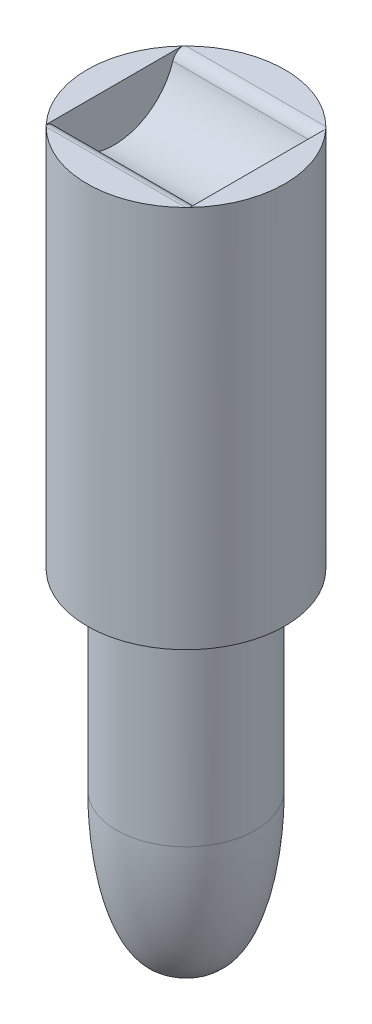
ISO-10303-21;
HEADER;
FILE_DESCRIPTION(('STEP AP214'),'2;1');
FILE_NAME('part.step','',(''),(''),'','','');
FILE_SCHEMA(('AUTOMOTIVE_DESIGN { 1 0 10303 214 1 1 1 1 }'));
ENDSEC;
DATA;
#1=APPLICATION_CONTEXT('core data for automotive mechanical design processes');
#2=APPLICATION_PROTOCOL_DEFINITION('international standard','automotive_design',2000,#1);
#3=PRODUCT_CONTEXT('',#1,'mechanical');
#4=PRODUCT('Part','Part','',(#3));
#5=PRODUCT_RELATED_PRODUCT_CATEGORY('part','',(#4));
#6=PRODUCT_DEFINITION_FORMATION('','',#4);
#7=PRODUCT_DEFINITION_CONTEXT('part definition',#1,'design');
#8=PRODUCT_DEFINITION('design','',#6,#7);
#9=PRODUCT_DEFINITION_SHAPE('','',#8);
#10=(LENGTH_UNIT() NAMED_UNIT(*) SI_UNIT(.MILLI.,.METRE.));
#11=(NAMED_UNIT(*) PLANE_ANGLE_UNIT() SI_UNIT($,.RADIAN.));
#12=(NAMED_UNIT(*) SI_UNIT($,.STERADIAN.) SOLID_ANGLE_UNIT());
#13=UNCERTAINTY_MEASURE_WITH_UNIT(LENGTH_MEASURE(1.E-05),#10,'distance_accuracy_value','');
#14=(GEOMETRIC_REPRESENTATION_CONTEXT(3) GLOBAL_UNCERTAINTY_ASSIGNED_CONTEXT((#13)) GLOBAL_UNIT_ASSIGNED_CONTEXT((#10,
#11,#12)) REPRESENTATION_CONTEXT('',''));
#15=CARTESIAN_POINT('',(0.,0.,0.));
#16=DIRECTION('',(0.,0.,1.));
#17=DIRECTION('',(1.,0.,0.));
#18=AXIS2_PLACEMENT_3D('',#15,#16,#17);
#19=CARTESIAN_POINT('',(0.,15.,0.));
#20=DIRECTION('',(0.,1.,0.));
#21=DIRECTION('',(0.,0.,1.));
#22=AXIS2_PLACEMENT_3D('',#19,#20,#21);
#23=PLANE('',#22);
#24=CARTESIAN_POINT('',(0.,15.,0.));
#25=DIRECTION('',(0.,1.,0.));
#26=DIRECTION('',(0.,0.,1.));
#27=AXIS2_PLACEMENT_3D('',#24,#25,#26);
#28=CIRCLE('',#27,2.06499999999998);
#29=CARTESIAN_POINT('',(1.45727267657518,15.,-1.4630725703489));
#30=VERTEX_POINT('',#29);
#31=CARTESIAN_POINT('',(-1.45727267657518,15.,-1.4630725703489));
#32=VERTEX_POINT('',#31);
#33=EDGE_CURVE('E151',#30,#32,#28,.T.);
#34=ORIENTED_EDGE('',*,*,#33,.T.);
#35=DIRECTION('',(-1.,0.,0.));
#36=VECTOR('',#35,1.);
#37=CARTESIAN_POINT('',(0.,15.,-1.4630725703489));
#38=LINE('',#37,#36);
#39=EDGE_CURVE('E129',#32,#30,#38,.F.);
#40=ORIENTED_EDGE('',*,*,#39,.T.);
#41=EDGE_LOOP('',(#34,#40));
#42=FACE_BOUND('',#41,.T.);
#43=ADVANCED_FACE('F48',(#42),#23,.T.);
#44=CARTESIAN_POINT('',(1.5,15.,1.41923394829743));
#45=VERTEX_POINT('',#44);
#46=CARTESIAN_POINT('',(1.5,15.,-1.41923394829743));
#47=VERTEX_POINT('',#46);
#48=EDGE_CURVE('E148',#45,#47,#28,.T.);
#49=ORIENTED_EDGE('',*,*,#48,.T.);
#50=DIRECTION('',(0.,0.,-1.));
#51=VECTOR('',#50,1.);
#52=CARTESIAN_POINT('',(1.5,15.,0.));
#53=LINE('',#52,#51);
#54=EDGE_CURVE('E66',#45,#47,#53,.T.);
#55=ORIENTED_EDGE('',*,*,#54,.F.);
#56=EDGE_LOOP('',(#49,#55));
#57=FACE_BOUND('',#56,.T.);
#58=ADVANCED_FACE('F236',(#57),#23,.T.);
#59=CARTESIAN_POINT('',(-1.45727267657518,15.,1.4630725703489));
#60=VERTEX_POINT('',#59);
#61=CARTESIAN_POINT('',(1.45727267657518,15.,1.4630725703489));
#62=VERTEX_POINT('',#61);
#63=EDGE_CURVE('E137',#60,#62,#28,.T.);
#64=ORIENTED_EDGE('',*,*,#63,.T.);
#65=DIRECTION('',(-1.,0.,0.));
#66=VECTOR('',#65,1.);
#67=CARTESIAN_POINT('',(0.,15.,1.4630725703489));
#68=LINE('',#67,#66);
#69=EDGE_CURVE('E118',#62,#60,#68,.T.);
#70=ORIENTED_EDGE('',*,*,#69,.T.);
#71=EDGE_LOOP('',(#64,#70));
#72=FACE_BOUND('',#71,.T.);
#73=ADVANCED_FACE('F143',(#72),#23,.T.);
#74=CARTESIAN_POINT('',(0.,7.,0.));
#75=DIRECTION('',(0.,-1.,0.));
#76=DIRECTION('',(0.,0.,-1.));
#77=AXIS2_PLACEMENT_3D('',#74,#75,#76);
#78=CYLINDRICAL_SURFACE('',#77,1.45);
#79=CARTESIAN_POINT('',(0.,3.,1.45));
#80=CARTESIAN_POINT('',(-0.189804399936706,3.,1.45));
#81=CARTESIAN_POINT('',(-0.379534576647298,3.,1.41226032138713));
#82=CARTESIAN_POINT('',(-0.730247377211466,3.,1.2669903228956));
#83=CARTESIAN_POINT('',(-0.891092854426223,3.,1.15951681101477));
#84=CARTESIAN_POINT('',(-1.15951681101477,3.,0.891092854426216));
#85=CARTESIAN_POINT('',(-1.2669903228956,3.,0.730247377211465));
#86=CARTESIAN_POINT('',(-1.41226032138713,3.,0.379534576647291));
#87=CARTESIAN_POINT('',(-1.45,3.,0.189804399936683));
#88=CARTESIAN_POINT('',(-1.45,3.,-0.189804399936678));
#89=CARTESIAN_POINT('',(-1.41226032138713,3.,-0.379534576647295));
#90=CARTESIAN_POINT('',(-1.2669903228956,3.,-0.730247377211469));
#91=CARTESIAN_POINT('',(-1.15951681101476,3.,-0.891092854426227));
#92=CARTESIAN_POINT('',(-0.891092854426228,3.,-1.15951681101476));
#93=CARTESIAN_POINT('',(-0.730247377211463,3.,-1.2669903228956));
#94=CARTESIAN_POINT('',(-0.379534576647293,3.,-1.41226032138713));
#95=CARTESIAN_POINT('',(-0.18980439993668,3.,-1.45));
#96=CARTESIAN_POINT('',(0.18980439993668,3.,-1.45));
#97=CARTESIAN_POINT('',(0.379534576647295,3.,-1.41226032138713));
#98=CARTESIAN_POINT('',(0.730247377211469,3.,-1.2669903228956));
#99=CARTESIAN_POINT('',(0.891092854426224,3.,-1.15951681101476));
#100=CARTESIAN_POINT('',(1.15951681101476,3.,-0.891092854426225));
#101=CARTESIAN_POINT('',(1.2669903228956,3.,-0.73024737721147));
#102=CARTESIAN_POINT('',(1.41226032138713,3.,-0.379534576647291));
#103=CARTESIAN_POINT('',(1.45,3.,-0.18980439993668));
#104=CARTESIAN_POINT('',(1.45,3.,0.18980439993668));
#105=CARTESIAN_POINT('',(1.41226032138713,3.,0.379534576647295));
#106=CARTESIAN_POINT('',(1.2669903228956,3.,0.730247377211464));
#107=CARTESIAN_POINT('',(1.15951681101476,3.,0.891092854426228));
#108=CARTESIAN_POINT('',(0.891092854426228,3.,1.15951681101476));
#109=CARTESIAN_POINT('',(0.730247377211467,3.,1.2669903228956));
#110=CARTESIAN_POINT('',(0.379534576647294,3.,1.41226032138713));
#111=CARTESIAN_POINT('',(0.189804399936705,3.,1.45));
#112=CARTESIAN_POINT('',(0.,3.,1.45));
#113=(BOUNDED_CURVE() B_SPLINE_CURVE(3,(#79,#80,#81,#82,#83,#84,#85,#86,#87,#88,#89,#90,#91,#92,
#93,#94,#95,#96,#97,#98,#99,#100,#101,#102,#103,#104,#105,#106,#107,#108,#109,#110,#111,#112),
.UNSPECIFIED.,.T.,.F.) B_SPLINE_CURVE_WITH_KNOTS((4,2,2,2,2,2,2,2,2,2,2,2,2,2,2,2,4),(0.,
0.392699081698725,0.785398163397448,1.17809724509617,1.5707963267949,1.96349540849362,
2.35619449019234,2.74889357189107,3.14159265358979,3.53429173528852,3.92699081698724,
4.31968989868597,4.71238898038469,5.10508806208341,5.49778714378214,5.89048622548086,
6.28318530717959),
.UNSPECIFIED.) CURVE() GEOMETRIC_REPRESENTATION_ITEM() RATIONAL_B_SPLINE_CURVE((1.,1.,1.,1.,1.,
1.,1.,1.,1.,1.,1.,1.,1.,1.,1.,1.,1.,1.,1.,1.,1.,1.,1.,1.,1.,1.,1.,1.,1.,1.,1.,1.,1.,1.)) REPRESENTATION_ITEM(''));
#114=CARTESIAN_POINT('',(0.,3.,1.45));
#115=VERTEX_POINT('',#114);
#116=EDGE_CURVE('E161',#115,#115,#113,.F.);
#117=ORIENTED_EDGE('',*,*,#116,.T.);
#118=EDGE_LOOP('',(#117));
#119=FACE_BOUND('',#118,.T.);
#120=CARTESIAN_POINT('',(0.,7.,0.));
#121=DIRECTION('',(0.,1.,0.));
#122=DIRECTION('',(0.,0.,1.));
#123=AXIS2_PLACEMENT_3D('',#120,#121,#122);
#124=CIRCLE('',#123,1.45);
#125=CARTESIAN_POINT('',(0.,7.,1.45));
#126=VERTEX_POINT('',#125);
#127=EDGE_CURVE('E157',#126,#126,#124,.T.);
#128=ORIENTED_EDGE('',*,*,#127,.F.);
#129=EDGE_LOOP('',(#128));
#130=FACE_BOUND('',#129,.T.);
#131=ADVANCED_FACE('F238',(#119,#130),#78,.T.);
#132=CARTESIAN_POINT('',(0.,0.,0.));
#133=DIRECTION('',(0.,1.,0.));
#134=DIRECTION('',(0.,0.,1.));
#135=AXIS2_PLACEMENT_3D('',#132,#133,#134);
#136=PLANE('',#135);
#137=CARTESIAN_POINT('',(0.,0.,0.45));
#138=CARTESIAN_POINT('',(0.0589048137734603,0.,0.45));
#139=CARTESIAN_POINT('',(0.117786592752609,0.,0.438287685947729));
#140=CARTESIAN_POINT('',(0.226628496375971,0.,0.393203893312428));
#141=CARTESIAN_POINT('',(0.276546058270209,0.,0.359850044797685));
#142=CARTESIAN_POINT('',(0.359850044797684,0.,0.276546058270207));
#143=CARTESIAN_POINT('',(0.393203893312429,0.,0.226628496375972));
#144=CARTESIAN_POINT('',(0.438287685947729,0.,0.117786592752609));
#145=CARTESIAN_POINT('',(0.45,0.,0.0589048137734525));
#146=CARTESIAN_POINT('',(0.45,0.,-0.0589048137734524));
#147=CARTESIAN_POINT('',(0.43828768594773,0.,-0.117786592752608));
#148=CARTESIAN_POINT('',(0.393203893312427,0.,-0.226628496375973));
#149=CARTESIAN_POINT('',(0.359850044797684,0.,-0.276546058270207));
#150=CARTESIAN_POINT('',(0.276546058270208,0.,-0.359850044797686));
#151=CARTESIAN_POINT('',(0.226628496375972,0.,-0.393203893312427));
#152=CARTESIAN_POINT('',(0.11778659275261,0.,-0.43828768594773));
#153=CARTESIAN_POINT('',(0.0589048137734525,0.,-0.45));
#154=CARTESIAN_POINT('',(-0.0589048137734524,0.,-0.45));
#155=CARTESIAN_POINT('',(-0.117786592752608,0.,-0.438287685947731));
#156=CARTESIAN_POINT('',(-0.226628496375971,0.,-0.393203893312428));
#157=CARTESIAN_POINT('',(-0.276546058270207,0.,-0.359850044797684));
#158=CARTESIAN_POINT('',(-0.359850044797686,0.,-0.276546058270208));
#159=CARTESIAN_POINT('',(-0.393203893312427,0.,-0.226628496375973));
#160=CARTESIAN_POINT('',(-0.438287685947731,0.,-0.117786592752609));
#161=CARTESIAN_POINT('',(-0.45,0.,-0.0589048137734518));
#162=CARTESIAN_POINT('',(-0.45,0.,0.0589048137734533));
#163=CARTESIAN_POINT('',(-0.438287685947731,0.,0.117786592752607));
#164=CARTESIAN_POINT('',(-0.393203893312427,0.,0.226628496375972));
#165=CARTESIAN_POINT('',(-0.359850044797686,0.,0.276546058270205));
#166=CARTESIAN_POINT('',(-0.276546058270208,0.,0.359850044797686));
#167=CARTESIAN_POINT('',(-0.226628496375973,0.,0.393203893312427));
#168=CARTESIAN_POINT('',(-0.117786592752609,0.,0.438287685947731));
#169=CARTESIAN_POINT('',(-0.0589048137734604,0.,0.45));
#170=CARTESIAN_POINT('',(0.,0.,0.45));
#171=(BOUNDED_CURVE() B_SPLINE_CURVE(3,(#137,#138,#139,#140,#141,#142,#143,#144,#145,#146,#147,
#148,#149,#150,#151,#152,#153,#154,#155,#156,#157,#158,#159,#160,#161,#162,#163,#164,#165,#166,
#167,#168,#169,#170),.UNSPECIFIED.,.T.,.F.) B_SPLINE_CURVE_WITH_KNOTS((4,2,2,2,2,2,2,2,2,2,2,2,
2,2,2,2,4),(0.,0.392699081698724,0.785398163397448,1.17809724509617,1.5707963267949,
1.96349540849362,2.35619449019234,2.74889357189107,3.14159265358979,3.53429173528852,
3.92699081698724,4.31968989868597,4.71238898038469,5.10508806208341,5.49778714378214,
5.89048622548086,6.28318530717959),
.UNSPECIFIED.) CURVE() GEOMETRIC_REPRESENTATION_ITEM() RATIONAL_B_SPLINE_CURVE((1.,1.,1.,1.,1.,
1.,1.,1.,1.,1.,1.,1.,1.,1.,1.,1.,1.,1.,1.,1.,1.,1.,1.,1.,1.,1.,1.,1.,1.,1.,1.,1.,1.,1.)) REPRESENTATION_ITEM(''));
#172=CARTESIAN_POINT('',(0.,0.,0.45));
#173=VERTEX_POINT('',#172);
#174=EDGE_CURVE('E346',#173,#173,#171,.F.);
#175=ORIENTED_EDGE('',*,*,#174,.T.);
#176=EDGE_LOOP('',(#175));
#177=FACE_BOUND('',#176,.T.);
#178=ADVANCED_FACE('F196',(#177),#136,.F.);
#179=CARTESIAN_POINT('',(0.,15.,0.));
#180=DIRECTION('',(0.,-1.,0.));
#181=DIRECTION('',(0.,0.,-1.));
#182=AXIS2_PLACEMENT_3D('',#179,#180,#181);
#183=CYLINDRICAL_SURFACE('',#182,2.06499999999998);
#184=ORIENTED_EDGE('',*,*,#33,.F.);
#185=CARTESIAN_POINT('',(1.45727267657518,15.,-1.4630725703489));
#186=CARTESIAN_POINT('',(1.4647692687819,14.9999992078518,-1.45560640391891));
#187=CARTESIAN_POINT('',(1.47220954596814,14.9996654348872,-1.44808012602613));
#188=CARTESIAN_POINT('',(1.48690380126563,14.9982983987213,-1.43298707318795));
#189=CARTESIAN_POINT('',(1.49415854632168,14.9972687778604,-1.42542071165644));
#190=CARTESIAN_POINT('',(1.50848778300309,14.9944770419405,-1.4102476435934));
#191=CARTESIAN_POINT('',(1.5155622465929,14.9927148136827,-1.40264093100643));
#192=CARTESIAN_POINT('',(1.52952453849525,14.988405261903,-1.38740324118233));
#193=CARTESIAN_POINT('',(1.53641119894096,14.9858538856625,-1.37977234473721));
#194=CARTESIAN_POINT('',(1.54316406741165,14.9828905138266,-1.37217697876384));
#195=B_SPLINE_CURVE_WITH_KNOTS('',3,(#185,#186,#187,#188,#189,#190,#191,#192,#193,#194),
.UNSPECIFIED.,.F.,.F.,(4,2,2,2,4),(0.,0.0317389513474401,0.0633130422873217,0.0948920137136338,
0.126635931963719),.UNSPECIFIED.);
#196=CARTESIAN_POINT('',(1.50000000000002,14.996126339949,-1.41923394829744));
#197=VERTEX_POINT('',#196);
#198=EDGE_CURVE('E130',#30,#197,#195,.T.);
#199=ORIENTED_EDGE('',*,*,#198,.T.);
#200=DIRECTION('',(0.,-1.,0.));
#201=VECTOR('',#200,1.);
#202=CARTESIAN_POINT('',(1.50000000000002,14.996126339949,-1.41923394829744));
#203=LINE('',#202,#201);
#204=EDGE_CURVE('E179',#197,#47,#203,.F.);
#205=ORIENTED_EDGE('',*,*,#204,.T.);
#206=ORIENTED_EDGE('',*,*,#48,.F.);
#207=DIRECTION('',(0.,-1.,0.));
#208=VECTOR('',#207,1.);
#209=CARTESIAN_POINT('',(1.5,15.,1.41923394829743));
#210=LINE('',#209,#208);
#211=CARTESIAN_POINT('',(1.50000000000002,14.996126339949,1.41923394829744));
#212=VERTEX_POINT('',#211);
#213=EDGE_CURVE('E139',#45,#212,#210,.T.);
#214=ORIENTED_EDGE('',*,*,#213,.T.);
#215=CARTESIAN_POINT('',(1.45727267657518,15.,1.4630725703489));
#216=CARTESIAN_POINT('',(1.4647692687819,14.9999992078518,1.45560640391891));
#217=CARTESIAN_POINT('',(1.47220954596814,14.9996654348872,1.44808012602613));
#218=CARTESIAN_POINT('',(1.48690380126563,14.9982983987213,1.43298707318795));
#219=CARTESIAN_POINT('',(1.49415854632168,14.9972687778604,1.42542071165644));
#220=CARTESIAN_POINT('',(1.50848778300309,14.9944770419405,1.4102476435934));
#221=CARTESIAN_POINT('',(1.5155622465929,14.9927148136827,1.40264093100643));
#222=CARTESIAN_POINT('',(1.52952453849525,14.988405261903,1.38740324118233));
#223=CARTESIAN_POINT('',(1.53641119894096,14.9858538856625,1.37977234473721));
#224=CARTESIAN_POINT('',(1.54316406741165,14.9828905138266,1.37217697876384));
#225=B_SPLINE_CURVE_WITH_KNOTS('',3,(#215,#216,#217,#218,#219,#220,#221,#222,#223,#224),
.UNSPECIFIED.,.F.,.F.,(4,2,2,2,4),(0.,0.0317389513474401,0.0633130422873217,0.0948920137136338,
0.126635931963719),.UNSPECIFIED.);
#226=EDGE_CURVE('E121',#212,#62,#225,.F.);
#227=ORIENTED_EDGE('',*,*,#226,.T.);
#228=ORIENTED_EDGE('',*,*,#63,.F.);
#229=CARTESIAN_POINT('',(-1.45727267657518,15.,1.4630725703489));
#230=CARTESIAN_POINT('',(-1.4647692687819,14.9999992078518,1.45560640391891));
#231=CARTESIAN_POINT('',(-1.47220954596814,14.9996654348872,1.44808012602613));
#232=CARTESIAN_POINT('',(-1.48690380126563,14.9982983987213,1.43298707318795));
#233=CARTESIAN_POINT('',(-1.49415854632168,14.9972687778604,1.42542071165644));
#234=CARTESIAN_POINT('',(-1.50848778300309,14.9944770419405,1.4102476435934));
#235=CARTESIAN_POINT('',(-1.5155622465929,14.9927148136827,1.40264093100643));
#236=CARTESIAN_POINT('',(-1.52952453849525,14.988405261903,1.38740324118233));
#237=CARTESIAN_POINT('',(-1.53641119894096,14.9858538856625,1.37977234473721));
#238=CARTESIAN_POINT('',(-1.54316406741165,14.9828905138266,1.37217697876384));
#239=B_SPLINE_CURVE_WITH_KNOTS('',3,(#229,#230,#231,#232,#233,#234,#235,#236,#237,#238),
.UNSPECIFIED.,.F.,.F.,(4,2,2,2,4),(0.,0.0317389513474401,0.0633130422873217,0.0948920137136338,
0.126635931963719),.UNSPECIFIED.);
#240=CARTESIAN_POINT('',(-1.50000000000002,14.996126339949,1.41923394829744));
#241=VERTEX_POINT('',#240);
#242=EDGE_CURVE('E124',#60,#241,#239,.T.);
#243=ORIENTED_EDGE('',*,*,#242,.T.);
#244=DIRECTION('',(0.,-1.,0.));
#245=VECTOR('',#244,1.);
#246=CARTESIAN_POINT('',(-1.50000000000002,14.996126339949,1.41923394829744));
#247=LINE('',#246,#245);
#248=CARTESIAN_POINT('',(-1.5,15.,1.41923394829743));
#249=VERTEX_POINT('',#248);
#250=EDGE_CURVE('E141',#241,#249,#247,.F.);
#251=ORIENTED_EDGE('',*,*,#250,.T.);
#252=CARTESIAN_POINT('',(-1.5,15.,-1.41923394829743));
#253=VERTEX_POINT('',#252);
#254=EDGE_CURVE('E145',#253,#249,#28,.T.);
#255=ORIENTED_EDGE('',*,*,#254,.F.);
#256=DIRECTION('',(0.,-1.,0.));
#257=VECTOR('',#256,1.);
#258=CARTESIAN_POINT('',(-1.5,15.,-1.41923394829743));
#259=LINE('',#258,#257);
#260=CARTESIAN_POINT('',(-1.50000000000002,14.996126339949,-1.41923394829744));
#261=VERTEX_POINT('',#260);
#262=EDGE_CURVE('E221',#253,#261,#259,.T.);
#263=ORIENTED_EDGE('',*,*,#262,.T.);
#264=CARTESIAN_POINT('',(-1.45727267657518,15.,-1.4630725703489));
#265=CARTESIAN_POINT('',(-1.4647692687819,14.9999992078518,-1.45560640391891));
#266=CARTESIAN_POINT('',(-1.47220954596814,14.9996654348872,-1.44808012602613));
#267=CARTESIAN_POINT('',(-1.48690380126563,14.9982983987213,-1.43298707318795));
#268=CARTESIAN_POINT('',(-1.49415854632168,14.9972687778604,-1.42542071165644));
#269=CARTESIAN_POINT('',(-1.50848778300309,14.9944770419405,-1.4102476435934));
#270=CARTESIAN_POINT('',(-1.5155622465929,14.9927148136827,-1.40264093100643));
#271=CARTESIAN_POINT('',(-1.52952453849525,14.988405261903,-1.38740324118233));
#272=CARTESIAN_POINT('',(-1.53641119894096,14.9858538856625,-1.37977234473721));
#273=CARTESIAN_POINT('',(-1.54316406741165,14.9828905138266,-1.37217697876384));
#274=B_SPLINE_CURVE_WITH_KNOTS('',3,(#264,#265,#266,#267,#268,#269,#270,#271,#272,#273),
.UNSPECIFIED.,.F.,.F.,(4,2,2,2,4),(0.,0.0317389513474401,0.0633130422873217,0.0948920137136338,
0.126635931963719),.UNSPECIFIED.);
#275=EDGE_CURVE('E172',#261,#32,#274,.F.);
#276=ORIENTED_EDGE('',*,*,#275,.T.);
#277=EDGE_LOOP('',(#184,#199,#205,#206,#214,#227,#228,#243,#251,#255,#263,#276));
#278=FACE_BOUND('',#277,.T.);
#279=CARTESIAN_POINT('',(0.,7.,0.));
#280=DIRECTION('',(0.,1.,0.));
#281=DIRECTION('',(0.,0.,1.));
#282=AXIS2_PLACEMENT_3D('',#279,#280,#281);
#283=CIRCLE('',#282,2.06499999999998);
#284=CARTESIAN_POINT('',(0.,7.,2.06499999999998));
#285=VERTEX_POINT('',#284);
#286=EDGE_CURVE('E146',#285,#285,#283,.T.);
#287=ORIENTED_EDGE('',*,*,#286,.T.);
#288=EDGE_LOOP('',(#287));
#289=FACE_BOUND('',#288,.T.);
#290=ADVANCED_FACE('F135',(#278,#289),#183,.T.);
#291=DIRECTION('',(0.,0.,-1.));
#292=VECTOR('',#291,1.);
#293=CARTESIAN_POINT('',(-1.5,15.,0.));
#294=LINE('',#293,#292);
#295=EDGE_CURVE('E73',#249,#253,#294,.T.);
#296=ORIENTED_EDGE('',*,*,#295,.T.);
#297=ORIENTED_EDGE('',*,*,#254,.T.);
#298=EDGE_LOOP('',(#296,#297));
#299=FACE_BOUND('',#298,.T.);
#300=ADVANCED_FACE('F195',(#299),#23,.T.);
#301=CARTESIAN_POINT('',(0.,7.,0.));
#302=DIRECTION('',(0.,1.,0.));
#303=DIRECTION('',(0.,0.,1.));
#304=AXIS2_PLACEMENT_3D('',#301,#302,#303);
#305=PLANE('',#304);
#306=ORIENTED_EDGE('',*,*,#127,.T.);
#307=EDGE_LOOP('',(#306));
#308=FACE_BOUND('',#307,.T.);
#309=ORIENTED_EDGE('',*,*,#286,.F.);
#310=EDGE_LOOP('',(#309));
#311=FACE_BOUND('',#310,.T.);
#312=ADVANCED_FACE('F197',(#308,#311),#305,.F.);
#313=CARTESIAN_POINT('',(0.,3.,1.45));
#314=CARTESIAN_POINT('',(0.189804399936705,3.,1.45));
#315=CARTESIAN_POINT('',(0.379534576647294,3.,1.41226032138713));
#316=CARTESIAN_POINT('',(0.730247377211467,3.,1.2669903228956));
#317=CARTESIAN_POINT('',(0.891092854426228,3.,1.15951681101476));
#318=CARTESIAN_POINT('',(1.15951681101476,3.,0.891092854426228));
#319=CARTESIAN_POINT('',(1.2669903228956,3.,0.730247377211464));
#320=CARTESIAN_POINT('',(1.41226032138713,3.,0.379534576647295));
#321=CARTESIAN_POINT('',(1.45,3.,0.18980439993668));
#322=CARTESIAN_POINT('',(1.45,3.,-0.18980439993668));
#323=CARTESIAN_POINT('',(1.41226032138713,3.,-0.379534576647291));
#324=CARTESIAN_POINT('',(1.2669903228956,3.,-0.73024737721147));
#325=CARTESIAN_POINT('',(1.15951681101476,3.,-0.891092854426225));
#326=CARTESIAN_POINT('',(0.891092854426224,3.,-1.15951681101476));
#327=CARTESIAN_POINT('',(0.730247377211469,3.,-1.2669903228956));
#328=CARTESIAN_POINT('',(0.379534576647295,3.,-1.41226032138713));
#329=CARTESIAN_POINT('',(0.18980439993668,3.,-1.45));
#330=CARTESIAN_POINT('',(-0.18980439993668,3.,-1.45));
#331=CARTESIAN_POINT('',(-0.379534576647293,3.,-1.41226032138713));
#332=CARTESIAN_POINT('',(-0.730247377211463,3.,-1.2669903228956));
#333=CARTESIAN_POINT('',(-0.891092854426228,3.,-1.15951681101476));
#334=CARTESIAN_POINT('',(-1.15951681101476,3.,-0.891092854426227));
#335=CARTESIAN_POINT('',(-1.2669903228956,3.,-0.730247377211469));
#336=CARTESIAN_POINT('',(-1.41226032138713,3.,-0.379534576647295));
#337=CARTESIAN_POINT('',(-1.45,3.,-0.189804399936678));
#338=CARTESIAN_POINT('',(-1.45,3.,0.189804399936683));
#339=CARTESIAN_POINT('',(-1.41226032138713,3.,0.379534576647291));
#340=CARTESIAN_POINT('',(-1.2669903228956,3.,0.730247377211465));
#341=CARTESIAN_POINT('',(-1.15951681101477,3.,0.891092854426216));
#342=CARTESIAN_POINT('',(-0.891092854426223,3.,1.15951681101477));
#343=CARTESIAN_POINT('',(-0.730247377211466,3.,1.2669903228956));
#344=CARTESIAN_POINT('',(-0.379534576647298,3.,1.41226032138713));
#345=CARTESIAN_POINT('',(-0.189804399936706,3.,1.45));
#346=CARTESIAN_POINT('',(0.,3.,1.45));
#347=CARTESIAN_POINT('',(0.,0.,1.45));
#348=CARTESIAN_POINT('',(0.189804399936705,0.,1.45));
#349=CARTESIAN_POINT('',(0.379534576647294,0.,1.41226032138713));
#350=CARTESIAN_POINT('',(0.730247377211466,0.,1.2669903228956));
#351=CARTESIAN_POINT('',(0.891092854426224,0.,1.15951681101476));
#352=CARTESIAN_POINT('',(1.15951681101476,0.,0.891092854426224));
#353=CARTESIAN_POINT('',(1.2669903228956,0.,0.730247377211464));
#354=CARTESIAN_POINT('',(1.41226032138713,0.,0.379534576647294));
#355=CARTESIAN_POINT('',(1.45,0.,0.18980439993668));
#356=CARTESIAN_POINT('',(1.45,0.,-0.18980439993668));
#357=CARTESIAN_POINT('',(1.41226032138715,0.,-0.379534576647292));
#358=CARTESIAN_POINT('',(1.26699032289558,0.,-0.730247377211469));
#359=CARTESIAN_POINT('',(1.15951681101476,0.,-0.891092854426211));
#360=CARTESIAN_POINT('',(0.891092854426229,0.,-1.15951681101478));
#361=CARTESIAN_POINT('',(0.73024737721147,0.,-1.2669903228956));
#362=CARTESIAN_POINT('',(0.379534576647293,0.,-1.41226032138713));
#363=CARTESIAN_POINT('',(0.18980439993668,0.,-1.45));
#364=CARTESIAN_POINT('',(-0.18980439993668,0.,-1.45));
#365=CARTESIAN_POINT('',(-0.379534576647292,0.,-1.41226032138712));
#366=CARTESIAN_POINT('',(-0.730247377211462,0.,-1.26699032289561));
#367=CARTESIAN_POINT('',(-0.891092854426218,0.,-1.15951681101475));
#368=CARTESIAN_POINT('',(-1.15951681101477,0.,-0.891092854426236));
#369=CARTESIAN_POINT('',(-1.26699032289559,0.,-0.73024737721147));
#370=CARTESIAN_POINT('',(-1.41226032138713,0.,-0.379534576647293));
#371=CARTESIAN_POINT('',(-1.45,0.,-0.189804399936678));
#372=CARTESIAN_POINT('',(-1.45,0.,0.189804399936683));
#373=CARTESIAN_POINT('',(-1.41226032138712,0.,0.379534576647289));
#374=CARTESIAN_POINT('',(-1.26699032289561,0.,0.730247377211466));
#375=CARTESIAN_POINT('',(-1.15951681101477,0.,0.891092854426215));
#376=CARTESIAN_POINT('',(-0.891092854426221,0.,1.15951681101476));
#377=CARTESIAN_POINT('',(-0.730247377211467,0.,1.26699032289561));
#378=CARTESIAN_POINT('',(-0.379534576647296,0.,1.41226032138711));
#379=CARTESIAN_POINT('',(-0.189804399936706,0.,1.45));
#380=CARTESIAN_POINT('',(0.,0.,1.45));
#381=CARTESIAN_POINT('',(0.,0.,0.45));
#382=CARTESIAN_POINT('',(0.0589048137734603,0.,0.45));
#383=CARTESIAN_POINT('',(0.117786592752609,0.,0.438287685947729));
#384=CARTESIAN_POINT('',(0.226628496375971,0.,0.393203893312428));
#385=CARTESIAN_POINT('',(0.276546058270209,0.,0.359850044797685));
#386=CARTESIAN_POINT('',(0.359850044797684,0.,0.276546058270207));
#387=CARTESIAN_POINT('',(0.393203893312429,0.,0.226628496375972));
#388=CARTESIAN_POINT('',(0.438287685947729,0.,0.117786592752609));
#389=CARTESIAN_POINT('',(0.45,0.,0.0589048137734525));
#390=CARTESIAN_POINT('',(0.45,0.,-0.0589048137734524));
#391=CARTESIAN_POINT('',(0.43828768594773,0.,-0.117786592752608));
#392=CARTESIAN_POINT('',(0.393203893312427,0.,-0.226628496375973));
#393=CARTESIAN_POINT('',(0.359850044797684,0.,-0.276546058270207));
#394=CARTESIAN_POINT('',(0.276546058270208,0.,-0.359850044797686));
#395=CARTESIAN_POINT('',(0.226628496375972,0.,-0.393203893312427));
#396=CARTESIAN_POINT('',(0.11778659275261,0.,-0.43828768594773));
#397=CARTESIAN_POINT('',(0.0589048137734525,0.,-0.45));
#398=CARTESIAN_POINT('',(-0.0589048137734524,0.,-0.45));
#399=CARTESIAN_POINT('',(-0.117786592752608,0.,-0.438287685947731));
#400=CARTESIAN_POINT('',(-0.226628496375971,0.,-0.393203893312428));
#401=CARTESIAN_POINT('',(-0.276546058270207,0.,-0.359850044797684));
#402=CARTESIAN_POINT('',(-0.359850044797686,0.,-0.276546058270208));
#403=CARTESIAN_POINT('',(-0.393203893312427,0.,-0.226628496375973));
#404=CARTESIAN_POINT('',(-0.438287685947731,0.,-0.117786592752609));
#405=CARTESIAN_POINT('',(-0.45,0.,-0.0589048137734518));
#406=CARTESIAN_POINT('',(-0.45,0.,0.0589048137734533));
#407=CARTESIAN_POINT('',(-0.438287685947731,0.,0.117786592752607));
#408=CARTESIAN_POINT('',(-0.393203893312427,0.,0.226628496375972));
#409=CARTESIAN_POINT('',(-0.359850044797686,0.,0.276546058270205));
#410=CARTESIAN_POINT('',(-0.276546058270208,0.,0.359850044797686));
#411=CARTESIAN_POINT('',(-0.226628496375973,0.,0.393203893312427));
#412=CARTESIAN_POINT('',(-0.117786592752609,0.,0.438287685947731));
#413=CARTESIAN_POINT('',(-0.0589048137734604,0.,0.45));
#414=CARTESIAN_POINT('',(0.,0.,0.45));
#415=(BOUNDED_SURFACE() B_SPLINE_SURFACE(2,3,((#313,#314,#315,#316,#317,#318,#319,#320,#321,
#322,#323,#324,#325,#326,#327,#328,#329,#330,#331,#332,#333,#334,#335,#336,#337,#338,#339,#340,
#341,#342,#343,#344,#345,#346),(#347,#348,#349,#350,#351,#352,#353,#354,#355,#356,#357,#358,
#359,#360,#361,#362,#363,#364,#365,#366,#367,#368,#369,#370,#371,#372,#373,#374,#375,#376,#377,
#378,#379,#380),(#381,#382,#383,#384,#385,#386,#387,#388,#389,#390,#391,#392,#393,#394,#395,
#396,#397,#398,#399,#400,#401,#402,#403,#404,#405,#406,#407,#408,#409,#410,#411,#412,#413,
#414)),.UNSPECIFIED.,.F.,.T.,.F.) B_SPLINE_SURFACE_WITH_KNOTS((3,3),(4,2,2,2,2,2,2,2,2,2,2,2,2,
2,2,2,4),(0.,1.),(0.,0.392699081698724,0.785398163397448,1.17809724509617,1.5707963267949,
1.96349540849362,2.35619449019234,2.74889357189107,3.14159265358979,3.53429173528852,
3.92699081698724,4.31968989868597,4.71238898038469,5.10508806208341,5.49778714378214,
5.89048622548086,6.28318530717959),
.UNSPECIFIED.) GEOMETRIC_REPRESENTATION_ITEM() RATIONAL_B_SPLINE_SURFACE(((1.,1.,1.,1.,1.,1.,1.,
1.,1.,1.,1.,1.,1.,1.,1.,1.,1.,1.,1.,1.,1.,1.,1.,1.,1.,1.,1.,1.,1.,1.,1.,1.,1.,1.),
(0.707106781186548,0.707106781186548,0.707106781186548,0.707106781186548,0.707106781186548,
0.707106781186548,0.707106781186548,0.707106781186548,0.707106781186548,0.707106781186548,
0.707106781186548,0.707106781186548,0.707106781186548,0.707106781186548,0.707106781186548,
0.707106781186548,0.707106781186548,0.707106781186548,0.707106781186548,0.707106781186548,
0.707106781186548,0.707106781186548,0.707106781186548,0.707106781186548,0.707106781186548,
0.707106781186548,0.707106781186548,0.707106781186548,0.707106781186548,0.707106781186548,
0.707106781186548,0.707106781186548,0.707106781186548,0.707106781186548),(1.,1.,1.,1.,1.,1.,1.,
1.,1.,1.,1.,1.,1.,1.,1.,1.,1.,1.,1.,1.,1.,1.,1.,1.,1.,1.,1.,1.,1.,1.,1.,1.,1.,1.))) REPRESENTATION_ITEM('') SURFACE());
#416=ORIENTED_EDGE('',*,*,#174,.F.);
#417=EDGE_LOOP('',(#416));
#418=FACE_BOUND('',#417,.T.);
#419=ORIENTED_EDGE('',*,*,#116,.F.);
#420=EDGE_LOOP('',(#419));
#421=FACE_BOUND('',#420,.T.);
#422=ADVANCED_FACE('F232',(#418,#421),#415,.T.);
#423=CARTESIAN_POINT('',(1.5,15.2,0.));
#424=DIRECTION('',(-1.,0.,0.));
#425=DIRECTION('',(0.,0.,1.));
#426=AXIS2_PLACEMENT_3D('',#423,#424,#425);
#427=CYLINDRICAL_SURFACE('',#426,1.28071269221475);
#428=CARTESIAN_POINT('',(1.5,15.2,0.));
#429=DIRECTION('',(1.,0.,0.));
#430=DIRECTION('',(0.,0.,-1.));
#431=AXIS2_PLACEMENT_3D('',#428,#429,#430);
#432=CIRCLE('',#431,1.28071269221475);
#433=CARTESIAN_POINT('',(1.5,14.8234951768364,1.22411973194393));
#434=VERTEX_POINT('',#433);
#435=CARTESIAN_POINT('',(1.5,14.8234951768364,-1.22411973194393));
#436=VERTEX_POINT('',#435);
#437=EDGE_CURVE('E153',#434,#436,#432,.T.);
#438=ORIENTED_EDGE('',*,*,#437,.T.);
#439=DIRECTION('',(-1.,0.,0.));
#440=VECTOR('',#439,1.);
#441=CARTESIAN_POINT('',(1.5,14.8234951768364,-1.22411973194393));
#442=LINE('',#441,#440);
#443=CARTESIAN_POINT('',(-1.5,14.8234951768364,-1.22411973194393));
#444=VERTEX_POINT('',#443);
#445=EDGE_CURVE('E427',#436,#444,#442,.T.);
#446=ORIENTED_EDGE('',*,*,#445,.T.);
#447=CARTESIAN_POINT('',(-1.5,15.2,0.));
#448=DIRECTION('',(1.,0.,0.));
#449=DIRECTION('',(0.,0.,-1.));
#450=AXIS2_PLACEMENT_3D('',#447,#448,#449);
#451=CIRCLE('',#450,1.28071269221475);
#452=CARTESIAN_POINT('',(-1.5,14.8234951768364,1.22411973194393));
#453=VERTEX_POINT('',#452);
#454=EDGE_CURVE('E439',#453,#444,#451,.T.);
#455=ORIENTED_EDGE('',*,*,#454,.F.);
#456=DIRECTION('',(-1.,0.,0.));
#457=VECTOR('',#456,1.);
#458=CARTESIAN_POINT('',(1.5,14.8234951768364,1.22411973194393));
#459=LINE('',#458,#457);
#460=EDGE_CURVE('E424',#453,#434,#459,.F.);
#461=ORIENTED_EDGE('',*,*,#460,.T.);
#462=EDGE_LOOP('',(#438,#446,#455,#461));
#463=FACE_BOUND('',#462,.T.);
#464=ADVANCED_FACE('F284',(#463),#427,.F.);
#465=CARTESIAN_POINT('',(1.5,15.2,0.));
#466=DIRECTION('',(1.,0.,0.));
#467=DIRECTION('',(0.,0.,-1.));
#468=AXIS2_PLACEMENT_3D('',#465,#466,#467);
#469=PLANE('',#468);
#470=ORIENTED_EDGE('',*,*,#54,.T.);
#471=ORIENTED_EDGE('',*,*,#204,.F.);
#472=CARTESIAN_POINT('',(1.5,14.75,-1.4630725703489));
#473=DIRECTION('',(1.,0.,0.));
#474=DIRECTION('',(0.,0.,-1.));
#475=AXIS2_PLACEMENT_3D('',#472,#473,#474);
#476=CIRCLE('',#475,0.25);
#477=EDGE_CURVE('E177',#197,#436,#476,.T.);
#478=ORIENTED_EDGE('',*,*,#477,.T.);
#479=ORIENTED_EDGE('',*,*,#437,.F.);
#480=CARTESIAN_POINT('',(1.5,14.75,1.4630725703489));
#481=DIRECTION('',(1.,0.,0.));
#482=DIRECTION('',(0.,0.,-1.));
#483=AXIS2_PLACEMENT_3D('',#480,#481,#482);
#484=CIRCLE('',#483,0.25);
#485=EDGE_CURVE('E12',#434,#212,#484,.T.);
#486=ORIENTED_EDGE('',*,*,#485,.T.);
#487=ORIENTED_EDGE('',*,*,#213,.F.);
#488=EDGE_LOOP('',(#470,#471,#478,#479,#486,#487));
#489=FACE_BOUND('',#488,.T.);
#490=ADVANCED_FACE('F290',(#489),#469,.F.);
#491=CARTESIAN_POINT('',(-1.5,15.2,0.));
#492=DIRECTION('',(1.,0.,0.));
#493=DIRECTION('',(0.,0.,-1.));
#494=AXIS2_PLACEMENT_3D('',#491,#492,#493);
#495=PLANE('',#494);
#496=ORIENTED_EDGE('',*,*,#295,.F.);
#497=ORIENTED_EDGE('',*,*,#250,.F.);
#498=CARTESIAN_POINT('',(-1.5,14.75,1.4630725703489));
#499=DIRECTION('',(1.,0.,0.));
#500=DIRECTION('',(0.,0.,-1.));
#501=AXIS2_PLACEMENT_3D('',#498,#499,#500);
#502=CIRCLE('',#501,0.25);
#503=EDGE_CURVE('E58',#241,#453,#502,.F.);
#504=ORIENTED_EDGE('',*,*,#503,.T.);
#505=ORIENTED_EDGE('',*,*,#454,.T.);
#506=CARTESIAN_POINT('',(-1.5,14.75,-1.4630725703489));
#507=DIRECTION('',(1.,0.,0.));
#508=DIRECTION('',(0.,0.,-1.));
#509=AXIS2_PLACEMENT_3D('',#506,#507,#508);
#510=CIRCLE('',#509,0.25);
#511=EDGE_CURVE('E435',#444,#261,#510,.F.);
#512=ORIENTED_EDGE('',*,*,#511,.T.);
#513=ORIENTED_EDGE('',*,*,#262,.F.);
#514=EDGE_LOOP('',(#496,#497,#504,#505,#512,#513));
#515=FACE_BOUND('',#514,.T.);
#516=ADVANCED_FACE('F298',(#515),#495,.T.);
#517=CARTESIAN_POINT('',(1.5,14.75,-1.4630725703489));
#518=DIRECTION('',(-1.,0.,0.));
#519=DIRECTION('',(0.,0.,1.));
#520=AXIS2_PLACEMENT_3D('',#517,#518,#519);
#521=CYLINDRICAL_SURFACE('',#520,0.25);
#522=ORIENTED_EDGE('',*,*,#511,.F.);
#523=ORIENTED_EDGE('',*,*,#445,.F.);
#524=ORIENTED_EDGE('',*,*,#477,.F.);
#525=ORIENTED_EDGE('',*,*,#198,.F.);
#526=ORIENTED_EDGE('',*,*,#39,.F.);
#527=ORIENTED_EDGE('',*,*,#275,.F.);
#528=EDGE_LOOP('',(#522,#523,#524,#525,#526,#527));
#529=FACE_BOUND('',#528,.T.);
#530=ADVANCED_FACE('F175',(#529),#521,.T.);
#531=CARTESIAN_POINT('',(1.5,14.75,1.4630725703489));
#532=DIRECTION('',(-1.,0.,0.));
#533=DIRECTION('',(0.,0.,1.));
#534=AXIS2_PLACEMENT_3D('',#531,#532,#533);
#535=CYLINDRICAL_SURFACE('',#534,0.25);
#536=ORIENTED_EDGE('',*,*,#485,.F.);
#537=ORIENTED_EDGE('',*,*,#460,.F.);
#538=ORIENTED_EDGE('',*,*,#503,.F.);
#539=ORIENTED_EDGE('',*,*,#242,.F.);
#540=ORIENTED_EDGE('',*,*,#69,.F.);
#541=ORIENTED_EDGE('',*,*,#226,.F.);
#542=EDGE_LOOP('',(#536,#537,#538,#539,#540,#541));
#543=FACE_BOUND('',#542,.T.);
#544=ADVANCED_FACE('F50',(#543),#535,.T.);
#545=CLOSED_SHELL('',(#43,#58,#73,#131,#178,#290,#300,#312,#422,#464,#490,#516,#530,#544));
#546=MANIFOLD_SOLID_BREP('B2',#545);
#547=ADVANCED_BREP_SHAPE_REPRESENTATION('',(#18,#546),#14);
#548=SHAPE_DEFINITION_REPRESENTATION(#9,#547);
ENDSEC;
END-ISO-10303-21;
